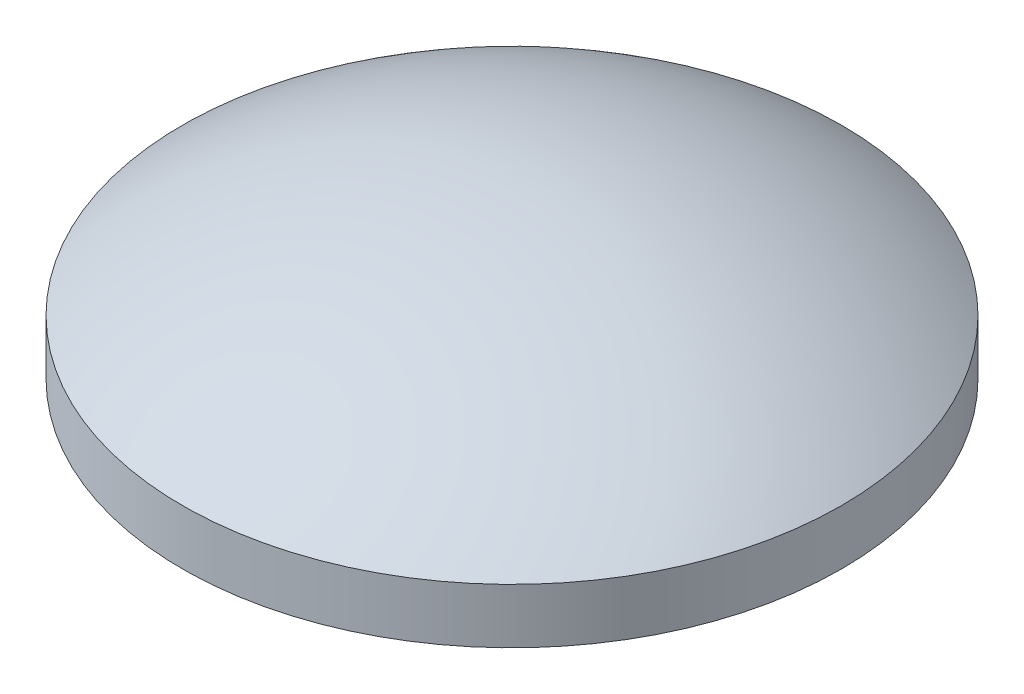
ISO-10303-21;
HEADER;
FILE_DESCRIPTION(('STEP AP214'),'2;1');
FILE_NAME('part.step','',(''),(''),'','','');
FILE_SCHEMA(('AUTOMOTIVE_DESIGN { 1 0 10303 214 1 1 1 1 }'));
ENDSEC;
DATA;
#1=APPLICATION_CONTEXT('core data for automotive mechanical design processes');
#2=APPLICATION_PROTOCOL_DEFINITION('international standard','automotive_design',2000,#1);
#3=PRODUCT_CONTEXT('',#1,'mechanical');
#4=PRODUCT('Part','Part','',(#3));
#5=PRODUCT_RELATED_PRODUCT_CATEGORY('part','',(#4));
#6=PRODUCT_DEFINITION_FORMATION('','',#4);
#7=PRODUCT_DEFINITION_CONTEXT('part definition',#1,'design');
#8=PRODUCT_DEFINITION('design','',#6,#7);
#9=PRODUCT_DEFINITION_SHAPE('','',#8);
#10=(LENGTH_UNIT() NAMED_UNIT(*) SI_UNIT(.MILLI.,.METRE.));
#11=(NAMED_UNIT(*) PLANE_ANGLE_UNIT() SI_UNIT($,.RADIAN.));
#12=(NAMED_UNIT(*) SI_UNIT($,.STERADIAN.) SOLID_ANGLE_UNIT());
#13=UNCERTAINTY_MEASURE_WITH_UNIT(LENGTH_MEASURE(1.E-05),#10,'distance_accuracy_value','');
#14=(GEOMETRIC_REPRESENTATION_CONTEXT(3) GLOBAL_UNCERTAINTY_ASSIGNED_CONTEXT((#13)) GLOBAL_UNIT_ASSIGNED_CONTEXT((#10,
#11,#12)) REPRESENTATION_CONTEXT('',''));
#15=CARTESIAN_POINT('',(0.,0.,0.));
#16=DIRECTION('',(0.,0.,1.));
#17=DIRECTION('',(1.,0.,0.));
#18=AXIS2_PLACEMENT_3D('',#15,#16,#17);
#19=CARTESIAN_POINT('',(0.,0.,0.));
#20=DIRECTION('',(0.,-1.,0.));
#21=DIRECTION('',(1.,0.,0.));
#22=AXIS2_PLACEMENT_3D('',#19,#20,#21);
#23=SPHERICAL_SURFACE('',#22,10.);
#24=CARTESIAN_POINT('',(0.,8.,0.));
#25=DIRECTION('',(0.,-1.,0.));
#26=DIRECTION('',(0.,0.,-1.));
#27=AXIS2_PLACEMENT_3D('',#24,#25,#26);
#28=CIRCLE('',#27,6.);
#29=CARTESIAN_POINT('',(0.,8.,-6.));
#30=VERTEX_POINT('',#29);
#31=EDGE_CURVE('E10',#30,#30,#28,.T.);
#32=ORIENTED_EDGE('',*,*,#31,.F.);
#33=EDGE_LOOP('',(#32));
#34=FACE_BOUND('',#33,.T.);
#35=ADVANCED_FACE('F43',(#34),#23,.T.);
#36=CARTESIAN_POINT('',(0.,-0.164536489972274,0.));
#37=DIRECTION('',(0.,-1.,0.));
#38=DIRECTION('',(0.,0.,-1.));
#39=AXIS2_PLACEMENT_3D('',#36,#37,#38);
#40=CYLINDRICAL_SURFACE('',#39,6.);
#41=ORIENTED_EDGE('',*,*,#31,.T.);
#42=EDGE_LOOP('',(#41));
#43=FACE_BOUND('',#42,.T.);
#44=CARTESIAN_POINT('',(0.,7.,0.));
#45=DIRECTION('',(0.,-1.,0.));
#46=DIRECTION('',(0.,0.,-1.));
#47=AXIS2_PLACEMENT_3D('',#44,#45,#46);
#48=CIRCLE('',#47,6.);
#49=CARTESIAN_POINT('',(0.,7.,-6.));
#50=VERTEX_POINT('',#49);
#51=EDGE_CURVE('E50',#50,#50,#48,.T.);
#52=ORIENTED_EDGE('',*,*,#51,.F.);
#53=EDGE_LOOP('',(#52));
#54=FACE_BOUND('',#53,.T.);
#55=ADVANCED_FACE('F59',(#43,#54),#40,.T.);
#56=CARTESIAN_POINT('',(0.,-0.999999999999996,0.));
#57=DIRECTION('',(0.,-1.,0.));
#58=DIRECTION('',(1.,0.,0.));
#59=AXIS2_PLACEMENT_3D('',#56,#57,#58);
#60=SPHERICAL_SURFACE('',#59,10.);
#61=ORIENTED_EDGE('',*,*,#51,.T.);
#62=EDGE_LOOP('',(#61));
#63=FACE_BOUND('',#62,.T.);
#64=ADVANCED_FACE('F57',(#63),#60,.F.);
#65=CLOSED_SHELL('',(#35,#55,#64));
#66=MANIFOLD_SOLID_BREP('B2',#65);
#67=ADVANCED_BREP_SHAPE_REPRESENTATION('',(#18,#66),#14);
#68=SHAPE_DEFINITION_REPRESENTATION(#9,#67);
ENDSEC;
END-ISO-10303-21;
